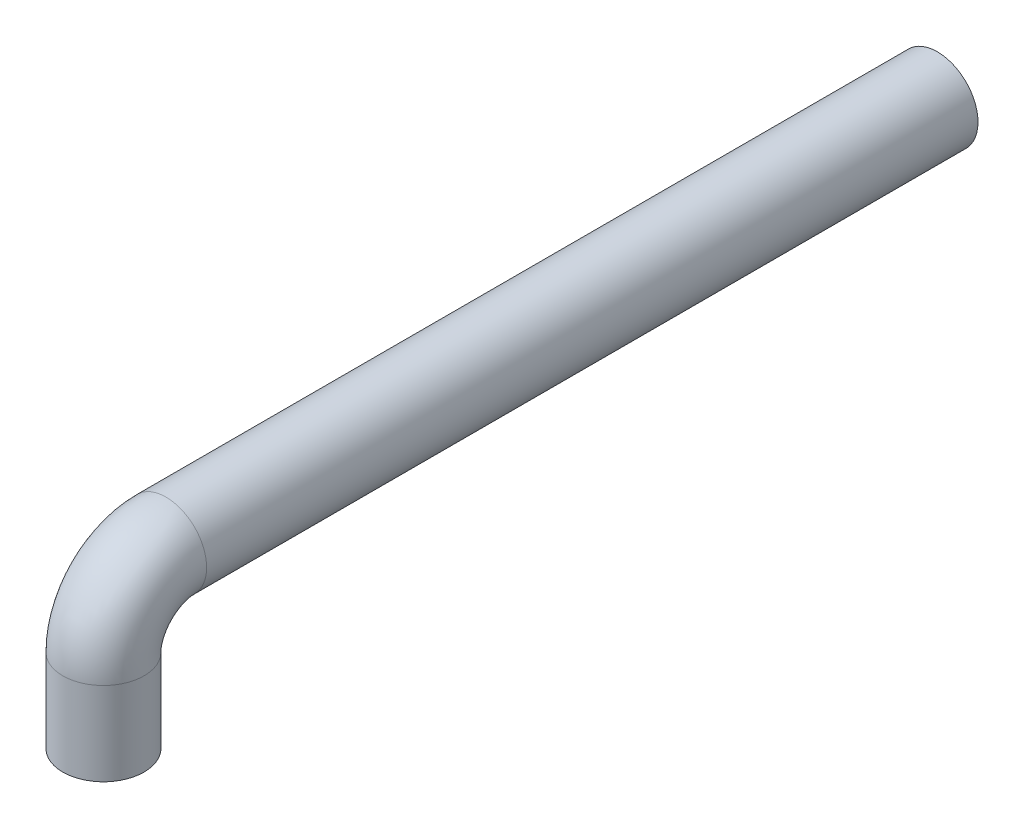
ISO-10303-21;
HEADER;
FILE_DESCRIPTION(('STEP AP214'),'2;1');
FILE_NAME('part.step','',(''),(''),'','','');
FILE_SCHEMA(('AUTOMOTIVE_DESIGN { 1 0 10303 214 1 1 1 1 }'));
ENDSEC;
DATA;
#1=APPLICATION_CONTEXT('core data for automotive mechanical design processes');
#2=APPLICATION_PROTOCOL_DEFINITION('international standard','automotive_design',2000,#1);
#3=PRODUCT_CONTEXT('',#1,'mechanical');
#4=PRODUCT('Part','Part','',(#3));
#5=PRODUCT_RELATED_PRODUCT_CATEGORY('part','',(#4));
#6=PRODUCT_DEFINITION_FORMATION('','',#4);
#7=PRODUCT_DEFINITION_CONTEXT('part definition',#1,'design');
#8=PRODUCT_DEFINITION('design','',#6,#7);
#9=PRODUCT_DEFINITION_SHAPE('','',#8);
#10=(LENGTH_UNIT() NAMED_UNIT(*) SI_UNIT(.MILLI.,.METRE.));
#11=(NAMED_UNIT(*) PLANE_ANGLE_UNIT() SI_UNIT($,.RADIAN.));
#12=(NAMED_UNIT(*) SI_UNIT($,.STERADIAN.) SOLID_ANGLE_UNIT());
#13=UNCERTAINTY_MEASURE_WITH_UNIT(LENGTH_MEASURE(1.E-05),#10,'distance_accuracy_value','');
#14=(GEOMETRIC_REPRESENTATION_CONTEXT(3) GLOBAL_UNCERTAINTY_ASSIGNED_CONTEXT((#13)) GLOBAL_UNIT_ASSIGNED_CONTEXT((#10,
#11,#12)) REPRESENTATION_CONTEXT('',''));
#15=CARTESIAN_POINT('',(0.,0.,0.));
#16=DIRECTION('',(0.,0.,1.));
#17=DIRECTION('',(1.,0.,0.));
#18=AXIS2_PLACEMENT_3D('',#15,#16,#17);
#19=CARTESIAN_POINT('',(0.,-17.78,101.6));
#20=DIRECTION('',(0.,-1.,0.));
#21=DIRECTION('',(1.,0.,0.));
#22=AXIS2_PLACEMENT_3D('',#19,#20,#21);
#23=PLANE('',#22);
#24=CARTESIAN_POINT('',(0.,-17.78,101.6));
#25=DIRECTION('',(0.,-1.,0.));
#26=DIRECTION('',(1.,0.,0.));
#27=AXIS2_PLACEMENT_3D('',#24,#25,#26);
#28=CIRCLE('',#27,4.953);
#29=CARTESIAN_POINT('',(4.953,-17.78,101.6));
#30=VERTEX_POINT('',#29);
#31=EDGE_CURVE('E53',#30,#30,#28,.T.);
#32=ORIENTED_EDGE('',*,*,#31,.T.);
#33=EDGE_LOOP('',(#32));
#34=FACE_BOUND('',#33,.T.);
#35=ADVANCED_FACE('F39',(#34),#23,.T.);
#36=CARTESIAN_POINT('',(0.,0.,0.));
#37=DIRECTION('',(0.,0.,1.));
#38=DIRECTION('',(1.,0.,0.));
#39=AXIS2_PLACEMENT_3D('',#36,#37,#38);
#40=PLANE('',#39);
#41=CARTESIAN_POINT('',(0.,0.,0.));
#42=DIRECTION('',(0.,0.,1.));
#43=DIRECTION('',(1.,0.,0.));
#44=AXIS2_PLACEMENT_3D('',#41,#42,#43);
#45=CIRCLE('',#44,4.953);
#46=CARTESIAN_POINT('',(4.953,0.,0.));
#47=VERTEX_POINT('',#46);
#48=EDGE_CURVE('E10',#47,#47,#45,.T.);
#49=ORIENTED_EDGE('',*,*,#48,.F.);
#50=EDGE_LOOP('',(#49));
#51=FACE_BOUND('',#50,.T.);
#52=ADVANCED_FACE('F63',(#51),#40,.F.);
#53=CARTESIAN_POINT('',(0.,-17.78,101.6));
#54=DIRECTION('',(0.,1.,0.));
#55=DIRECTION('',(0.,0.,1.));
#56=AXIS2_PLACEMENT_3D('',#53,#54,#55);
#57=CYLINDRICAL_SURFACE('',#56,4.953);
#58=CARTESIAN_POINT('',(0.,-7.61999999999997,101.6));
#59=DIRECTION('',(0.,-1.,0.));
#60=DIRECTION('',(1.,0.,0.));
#61=AXIS2_PLACEMENT_3D('',#58,#59,#60);
#62=CIRCLE('',#61,4.953);
#63=CARTESIAN_POINT('',(0.,-7.61999999999995,106.553));
#64=VERTEX_POINT('',#63);
#65=EDGE_CURVE('E49',#64,#64,#62,.T.);
#66=ORIENTED_EDGE('',*,*,#65,.T.);
#67=EDGE_LOOP('',(#66));
#68=FACE_BOUND('',#67,.T.);
#69=ORIENTED_EDGE('',*,*,#31,.F.);
#70=EDGE_LOOP('',(#69));
#71=FACE_BOUND('',#70,.T.);
#72=ADVANCED_FACE('F60',(#68,#71),#57,.T.);
#73=CARTESIAN_POINT('',(0.,-7.62,93.98));
#74=DIRECTION('',(-1.,0.,0.));
#75=DIRECTION('',(0.,0.,1.));
#76=AXIS2_PLACEMENT_3D('',#73,#74,#75);
#77=TOROIDAL_SURFACE('',#76,7.62,4.953);
#78=CARTESIAN_POINT('',(0.,0.,93.98));
#79=DIRECTION('',(0.,0.,1.));
#80=DIRECTION('',(1.,0.,0.));
#81=AXIS2_PLACEMENT_3D('',#78,#79,#80);
#82=CIRCLE('',#81,4.953);
#83=CARTESIAN_POINT('',(0.,4.953,93.9799999999999));
#84=VERTEX_POINT('',#83);
#85=EDGE_CURVE('E45',#84,#84,#82,.T.);
#86=CARTESIAN_POINT('',(0.,-7.62,93.98));
#87=DIRECTION('',(-1.,0.,0.));
#88=DIRECTION('',(0.,0.,1.));
#89=AXIS2_PLACEMENT_3D('',#86,#87,#88);
#90=CIRCLE('',#89,12.573);
#91=EDGE_CURVE('',#64,#84,#90,.T.);
#92=ORIENTED_EDGE('',*,*,#65,.F.);
#93=ORIENTED_EDGE('',*,*,#85,.T.);
#94=ORIENTED_EDGE('',*,*,#91,.T.);
#95=ORIENTED_EDGE('',*,*,#91,.F.);
#96=EDGE_LOOP('',(#92,#94,#93,#95));
#97=FACE_BOUND('',#96,.T.);
#98=ADVANCED_FACE('F62',(#97),#77,.T.);
#99=CARTESIAN_POINT('',(0.,0.,93.98));
#100=DIRECTION('',(0.,0.,-1.));
#101=DIRECTION('',(-1.,0.,0.));
#102=AXIS2_PLACEMENT_3D('',#99,#100,#101);
#103=CYLINDRICAL_SURFACE('',#102,4.953);
#104=ORIENTED_EDGE('',*,*,#48,.T.);
#105=EDGE_LOOP('',(#104));
#106=FACE_BOUND('',#105,.T.);
#107=ORIENTED_EDGE('',*,*,#85,.F.);
#108=EDGE_LOOP('',(#107));
#109=FACE_BOUND('',#108,.T.);
#110=ADVANCED_FACE('F70',(#106,#109),#103,.T.);
#111=CLOSED_SHELL('',(#35,#52,#72,#98,#110));
#112=MANIFOLD_SOLID_BREP('B2',#111);
#113=ADVANCED_BREP_SHAPE_REPRESENTATION('',(#18,#112),#14);
#114=SHAPE_DEFINITION_REPRESENTATION(#9,#113);
ENDSEC;
END-ISO-10303-21;
